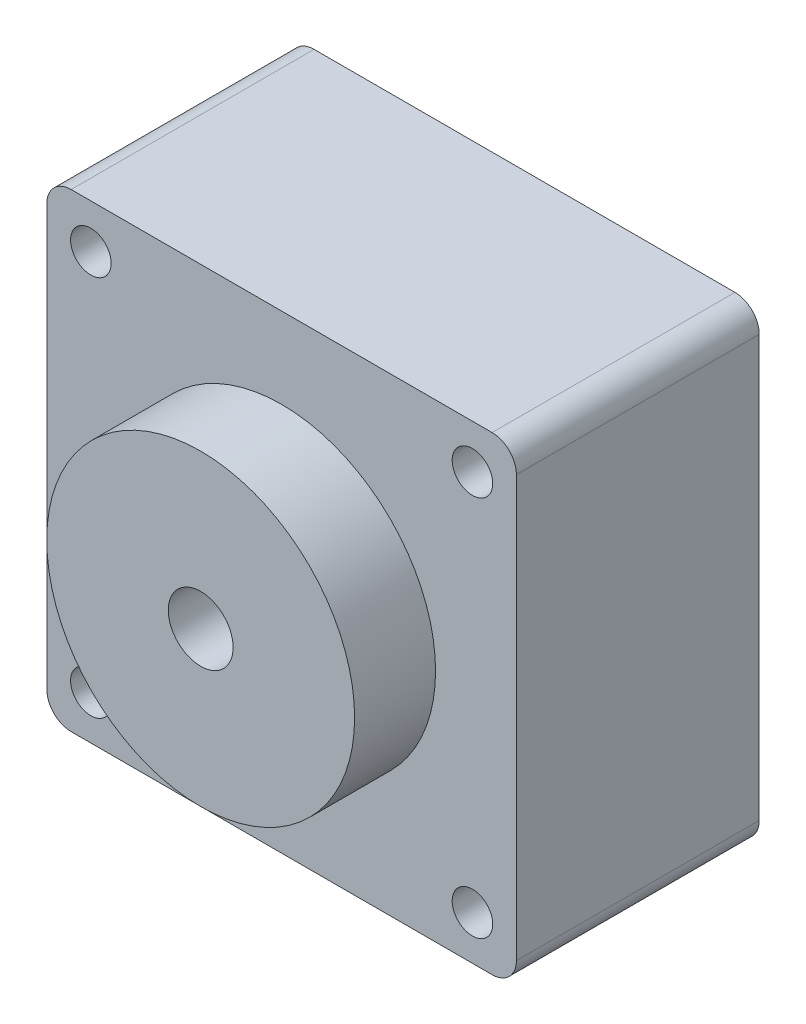
ISO-10303-21;
HEADER;
FILE_DESCRIPTION(('STEP AP214'),'2;1');
FILE_NAME('part.step','',(''),(''),'','','');
FILE_SCHEMA(('AUTOMOTIVE_DESIGN { 1 0 10303 214 1 1 1 1 }'));
ENDSEC;
DATA;
#1=APPLICATION_CONTEXT('core data for automotive mechanical design processes');
#2=APPLICATION_PROTOCOL_DEFINITION('international standard','automotive_design',2000,#1);
#3=PRODUCT_CONTEXT('',#1,'mechanical');
#4=PRODUCT('Part','Part','',(#3));
#5=PRODUCT_RELATED_PRODUCT_CATEGORY('part','',(#4));
#6=PRODUCT_DEFINITION_FORMATION('','',#4);
#7=PRODUCT_DEFINITION_CONTEXT('part definition',#1,'design');
#8=PRODUCT_DEFINITION('design','',#6,#7);
#9=PRODUCT_DEFINITION_SHAPE('','',#8);
#10=(LENGTH_UNIT() NAMED_UNIT(*) SI_UNIT(.MILLI.,.METRE.));
#11=(NAMED_UNIT(*) PLANE_ANGLE_UNIT() SI_UNIT($,.RADIAN.));
#12=(NAMED_UNIT(*) SI_UNIT($,.STERADIAN.) SOLID_ANGLE_UNIT());
#13=UNCERTAINTY_MEASURE_WITH_UNIT(LENGTH_MEASURE(1.E-05),#10,'distance_accuracy_value','');
#14=(GEOMETRIC_REPRESENTATION_CONTEXT(3) GLOBAL_UNCERTAINTY_ASSIGNED_CONTEXT((#13)) GLOBAL_UNIT_ASSIGNED_CONTEXT((#10,
#11,#12)) REPRESENTATION_CONTEXT('',''));
#15=CARTESIAN_POINT('',(0.,0.,0.));
#16=DIRECTION('',(0.,0.,1.));
#17=DIRECTION('',(1.,0.,0.));
#18=AXIS2_PLACEMENT_3D('',#15,#16,#17);
#19=CARTESIAN_POINT('',(3.,3.,30.));
#20=DIRECTION('',(0.,0.,-1.));
#21=DIRECTION('',(-1.,0.,0.));
#22=AXIS2_PLACEMENT_3D('',#19,#20,#21);
#23=CYLINDRICAL_SURFACE('',#22,3.);
#24=DIRECTION('',(0.,0.,-1.));
#25=VECTOR('',#24,1.);
#26=CARTESIAN_POINT('',(3.,0.,30.));
#27=LINE('',#26,#25);
#28=CARTESIAN_POINT('',(3.,0.,30.));
#29=VERTEX_POINT('',#28);
#30=CARTESIAN_POINT('',(3.,0.,0.));
#31=VERTEX_POINT('',#30);
#32=EDGE_CURVE('E168',#29,#31,#27,.T.);
#33=ORIENTED_EDGE('',*,*,#32,.F.);
#34=CARTESIAN_POINT('',(3.,3.,30.));
#35=DIRECTION('',(0.,0.,-1.));
#36=DIRECTION('',(-1.,0.,0.));
#37=AXIS2_PLACEMENT_3D('',#34,#35,#36);
#38=CIRCLE('',#37,3.);
#39=CARTESIAN_POINT('',(0.,3.,30.));
#40=VERTEX_POINT('',#39);
#41=EDGE_CURVE('E47',#40,#29,#38,.F.);
#42=ORIENTED_EDGE('',*,*,#41,.F.);
#43=DIRECTION('',(0.,0.,-1.));
#44=VECTOR('',#43,1.);
#45=CARTESIAN_POINT('',(0.,3.,30.));
#46=LINE('',#45,#44);
#47=CARTESIAN_POINT('',(0.,3.,0.));
#48=VERTEX_POINT('',#47);
#49=EDGE_CURVE('E172',#48,#40,#46,.F.);
#50=ORIENTED_EDGE('',*,*,#49,.F.);
#51=CARTESIAN_POINT('',(3.,3.,0.));
#52=DIRECTION('',(0.,0.,-1.));
#53=DIRECTION('',(-1.,0.,0.));
#54=AXIS2_PLACEMENT_3D('',#51,#52,#53);
#55=CIRCLE('',#54,3.);
#56=EDGE_CURVE('E11',#31,#48,#55,.T.);
#57=ORIENTED_EDGE('',*,*,#56,.F.);
#58=EDGE_LOOP('',(#33,#42,#50,#57));
#59=FACE_BOUND('',#58,.T.);
#60=ADVANCED_FACE('F39',(#59),#23,.T.);
#61=CARTESIAN_POINT('',(2.99999999999999,55.,30.));
#62=DIRECTION('',(0.,0.,1.));
#63=DIRECTION('',(1.,0.,0.));
#64=AXIS2_PLACEMENT_3D('',#61,#62,#63);
#65=CYLINDRICAL_SURFACE('',#64,3.);
#66=DIRECTION('',(0.,0.,1.));
#67=VECTOR('',#66,1.);
#68=CARTESIAN_POINT('',(2.99999999999999,58.,30.));
#69=LINE('',#68,#67);
#70=CARTESIAN_POINT('',(2.99999999999999,58.,0.));
#71=VERTEX_POINT('',#70);
#72=CARTESIAN_POINT('',(2.99999999999999,58.,30.));
#73=VERTEX_POINT('',#72);
#74=EDGE_CURVE('E154',#71,#73,#69,.T.);
#75=ORIENTED_EDGE('',*,*,#74,.F.);
#76=CARTESIAN_POINT('',(2.99999999999999,55.,0.));
#77=DIRECTION('',(0.,0.,-1.));
#78=DIRECTION('',(-1.,0.,0.));
#79=AXIS2_PLACEMENT_3D('',#76,#77,#78);
#80=CIRCLE('',#79,3.);
#81=CARTESIAN_POINT('',(0.,55.,0.));
#82=VERTEX_POINT('',#81);
#83=EDGE_CURVE('E162',#82,#71,#80,.T.);
#84=ORIENTED_EDGE('',*,*,#83,.F.);
#85=DIRECTION('',(0.,0.,1.));
#86=VECTOR('',#85,1.);
#87=CARTESIAN_POINT('',(0.,55.,30.));
#88=LINE('',#87,#86);
#89=CARTESIAN_POINT('',(0.,55.,30.));
#90=VERTEX_POINT('',#89);
#91=EDGE_CURVE('E158',#90,#82,#88,.F.);
#92=ORIENTED_EDGE('',*,*,#91,.F.);
#93=CARTESIAN_POINT('',(2.99999999999999,55.,30.));
#94=DIRECTION('',(0.,0.,-1.));
#95=DIRECTION('',(-1.,0.,0.));
#96=AXIS2_PLACEMENT_3D('',#93,#94,#95);
#97=CIRCLE('',#96,3.);
#98=EDGE_CURVE('E165',#73,#90,#97,.F.);
#99=ORIENTED_EDGE('',*,*,#98,.F.);
#100=EDGE_LOOP('',(#75,#84,#92,#99));
#101=FACE_BOUND('',#100,.T.);
#102=ADVANCED_FACE('F210',(#101),#65,.T.);
#103=CARTESIAN_POINT('',(55.,3.,30.));
#104=DIRECTION('',(0.,0.,1.));
#105=DIRECTION('',(1.,0.,0.));
#106=AXIS2_PLACEMENT_3D('',#103,#104,#105);
#107=CYLINDRICAL_SURFACE('',#106,3.);
#108=DIRECTION('',(0.,0.,1.));
#109=VECTOR('',#108,1.);
#110=CARTESIAN_POINT('',(55.,0.,30.));
#111=LINE('',#110,#109);
#112=CARTESIAN_POINT('',(55.,0.,0.));
#113=VERTEX_POINT('',#112);
#114=CARTESIAN_POINT('',(55.,0.,30.));
#115=VERTEX_POINT('',#114);
#116=EDGE_CURVE('E142',#113,#115,#111,.T.);
#117=ORIENTED_EDGE('',*,*,#116,.F.);
#118=CARTESIAN_POINT('',(55.,3.,0.));
#119=DIRECTION('',(0.,0.,-1.));
#120=DIRECTION('',(-1.,0.,0.));
#121=AXIS2_PLACEMENT_3D('',#118,#119,#120);
#122=CIRCLE('',#121,3.);
#123=CARTESIAN_POINT('',(58.,3.,0.));
#124=VERTEX_POINT('',#123);
#125=EDGE_CURVE('E148',#124,#113,#122,.T.);
#126=ORIENTED_EDGE('',*,*,#125,.F.);
#127=DIRECTION('',(0.,0.,1.));
#128=VECTOR('',#127,1.);
#129=CARTESIAN_POINT('',(58.,3.,30.));
#130=LINE('',#129,#128);
#131=CARTESIAN_POINT('',(58.,3.,30.));
#132=VERTEX_POINT('',#131);
#133=EDGE_CURVE('E110',#132,#124,#130,.F.);
#134=ORIENTED_EDGE('',*,*,#133,.F.);
#135=CARTESIAN_POINT('',(55.,3.,30.));
#136=DIRECTION('',(0.,0.,-1.));
#137=DIRECTION('',(-1.,0.,0.));
#138=AXIS2_PLACEMENT_3D('',#135,#136,#137);
#139=CIRCLE('',#138,3.);
#140=EDGE_CURVE('E151',#115,#132,#139,.F.);
#141=ORIENTED_EDGE('',*,*,#140,.F.);
#142=EDGE_LOOP('',(#117,#126,#134,#141));
#143=FACE_BOUND('',#142,.T.);
#144=ADVANCED_FACE('F204',(#143),#107,.T.);
#145=CARTESIAN_POINT('',(55.,55.,30.));
#146=DIRECTION('',(0.,0.,1.));
#147=DIRECTION('',(1.,0.,0.));
#148=AXIS2_PLACEMENT_3D('',#145,#146,#147);
#149=CYLINDRICAL_SURFACE('',#148,3.);
#150=DIRECTION('',(0.,0.,1.));
#151=VECTOR('',#150,1.);
#152=CARTESIAN_POINT('',(58.,55.,30.));
#153=LINE('',#152,#151);
#154=CARTESIAN_POINT('',(58.,55.,0.));
#155=VERTEX_POINT('',#154);
#156=CARTESIAN_POINT('',(58.,55.,30.));
#157=VERTEX_POINT('',#156);
#158=EDGE_CURVE('E108',#155,#157,#153,.T.);
#159=ORIENTED_EDGE('',*,*,#158,.F.);
#160=CARTESIAN_POINT('',(55.,55.,0.));
#161=DIRECTION('',(0.,0.,-1.));
#162=DIRECTION('',(-1.,0.,0.));
#163=AXIS2_PLACEMENT_3D('',#160,#161,#162);
#164=CIRCLE('',#163,3.);
#165=CARTESIAN_POINT('',(55.,58.,0.));
#166=VERTEX_POINT('',#165);
#167=EDGE_CURVE('E117',#166,#155,#164,.T.);
#168=ORIENTED_EDGE('',*,*,#167,.F.);
#169=DIRECTION('',(0.,0.,1.));
#170=VECTOR('',#169,1.);
#171=CARTESIAN_POINT('',(55.,58.,30.));
#172=LINE('',#171,#170);
#173=CARTESIAN_POINT('',(55.,58.,30.));
#174=VERTEX_POINT('',#173);
#175=EDGE_CURVE('E125',#174,#166,#172,.F.);
#176=ORIENTED_EDGE('',*,*,#175,.F.);
#177=CARTESIAN_POINT('',(55.,55.,30.));
#178=DIRECTION('',(0.,0.,-1.));
#179=DIRECTION('',(-1.,0.,0.));
#180=AXIS2_PLACEMENT_3D('',#177,#178,#179);
#181=CIRCLE('',#180,3.);
#182=EDGE_CURVE('E124',#157,#174,#181,.F.);
#183=ORIENTED_EDGE('',*,*,#182,.F.);
#184=EDGE_LOOP('',(#159,#168,#176,#183));
#185=FACE_BOUND('',#184,.T.);
#186=ADVANCED_FACE('F128',(#185),#149,.T.);
#187=CARTESIAN_POINT('',(0.,0.,30.));
#188=DIRECTION('',(1.,0.,0.));
#189=DIRECTION('',(0.,1.,0.));
#190=AXIS2_PLACEMENT_3D('',#187,#188,#189);
#191=PLANE('',#190);
#192=DIRECTION('',(0.,-1.,0.));
#193=VECTOR('',#192,1.);
#194=CARTESIAN_POINT('',(0.,0.,0.));
#195=LINE('',#194,#193);
#196=EDGE_CURVE('E197',#82,#48,#195,.T.);
#197=ORIENTED_EDGE('',*,*,#196,.T.);
#198=ORIENTED_EDGE('',*,*,#49,.T.);
#199=DIRECTION('',(0.,-1.,0.));
#200=VECTOR('',#199,1.);
#201=CARTESIAN_POINT('',(0.,0.,30.));
#202=LINE('',#201,#200);
#203=EDGE_CURVE('E182',#90,#40,#202,.T.);
#204=ORIENTED_EDGE('',*,*,#203,.F.);
#205=ORIENTED_EDGE('',*,*,#91,.T.);
#206=EDGE_LOOP('',(#197,#198,#204,#205));
#207=FACE_BOUND('',#206,.T.);
#208=ADVANCED_FACE('F213',(#207),#191,.F.);
#209=CARTESIAN_POINT('',(0.,0.,30.));
#210=DIRECTION('',(0.,1.,0.));
#211=DIRECTION('',(0.,0.,1.));
#212=AXIS2_PLACEMENT_3D('',#209,#210,#211);
#213=PLANE('',#212);
#214=DIRECTION('',(1.,0.,0.));
#215=VECTOR('',#214,1.);
#216=CARTESIAN_POINT('',(0.,0.,30.));
#217=LINE('',#216,#215);
#218=EDGE_CURVE('E179',#29,#115,#217,.T.);
#219=ORIENTED_EDGE('',*,*,#218,.F.);
#220=ORIENTED_EDGE('',*,*,#32,.T.);
#221=DIRECTION('',(1.,0.,0.));
#222=VECTOR('',#221,1.);
#223=CARTESIAN_POINT('',(0.,0.,0.));
#224=LINE('',#223,#222);
#225=EDGE_CURVE('E114',#31,#113,#224,.T.);
#226=ORIENTED_EDGE('',*,*,#225,.T.);
#227=ORIENTED_EDGE('',*,*,#116,.T.);
#228=EDGE_LOOP('',(#219,#220,#226,#227));
#229=FACE_BOUND('',#228,.T.);
#230=ADVANCED_FACE('F184',(#229),#213,.F.);
#231=CARTESIAN_POINT('',(58.,0.,30.));
#232=DIRECTION('',(-1.,0.,0.));
#233=DIRECTION('',(0.,-1.,0.));
#234=AXIS2_PLACEMENT_3D('',#231,#232,#233);
#235=PLANE('',#234);
#236=DIRECTION('',(0.,1.,0.));
#237=VECTOR('',#236,1.);
#238=CARTESIAN_POINT('',(58.,0.,30.));
#239=LINE('',#238,#237);
#240=EDGE_CURVE('E187',#132,#157,#239,.T.);
#241=ORIENTED_EDGE('',*,*,#240,.F.);
#242=ORIENTED_EDGE('',*,*,#133,.T.);
#243=DIRECTION('',(0.,1.,0.));
#244=VECTOR('',#243,1.);
#245=CARTESIAN_POINT('',(58.,0.,0.));
#246=LINE('',#245,#244);
#247=EDGE_CURVE('E103',#124,#155,#246,.T.);
#248=ORIENTED_EDGE('',*,*,#247,.T.);
#249=ORIENTED_EDGE('',*,*,#158,.T.);
#250=EDGE_LOOP('',(#241,#242,#248,#249));
#251=FACE_BOUND('',#250,.T.);
#252=ADVANCED_FACE('F106',(#251),#235,.F.);
#253=CARTESIAN_POINT('',(0.,58.,30.));
#254=DIRECTION('',(0.,-1.,0.));
#255=DIRECTION('',(0.,0.,-1.));
#256=AXIS2_PLACEMENT_3D('',#253,#254,#255);
#257=PLANE('',#256);
#258=DIRECTION('',(-1.,0.,0.));
#259=VECTOR('',#258,1.);
#260=CARTESIAN_POINT('',(0.,58.,0.));
#261=LINE('',#260,#259);
#262=EDGE_CURVE('E113',#166,#71,#261,.T.);
#263=ORIENTED_EDGE('',*,*,#262,.T.);
#264=ORIENTED_EDGE('',*,*,#74,.T.);
#265=DIRECTION('',(-1.,0.,0.));
#266=VECTOR('',#265,1.);
#267=CARTESIAN_POINT('',(0.,58.,30.));
#268=LINE('',#267,#266);
#269=EDGE_CURVE('E136',#174,#73,#268,.T.);
#270=ORIENTED_EDGE('',*,*,#269,.F.);
#271=ORIENTED_EDGE('',*,*,#175,.T.);
#272=EDGE_LOOP('',(#263,#264,#270,#271));
#273=FACE_BOUND('',#272,.T.);
#274=ADVANCED_FACE('F207',(#273),#257,.F.);
#275=CARTESIAN_POINT('',(0.,0.,30.));
#276=DIRECTION('',(0.,0.,-1.));
#277=DIRECTION('',(-1.,0.,0.));
#278=AXIS2_PLACEMENT_3D('',#275,#276,#277);
#279=PLANE('',#278);
#280=CARTESIAN_POINT('',(52.57,5.4300000000001,30.));
#281=DIRECTION('',(0.,0.,1.));
#282=DIRECTION('',(1.,0.,0.));
#283=AXIS2_PLACEMENT_3D('',#280,#281,#282);
#284=CIRCLE('',#283,2.505);
#285=CARTESIAN_POINT('',(55.075,5.4300000000001,30.));
#286=VERTEX_POINT('',#285);
#287=EDGE_CURVE('E377',#286,#286,#284,.T.);
#288=ORIENTED_EDGE('',*,*,#287,.F.);
#289=EDGE_LOOP('',(#288));
#290=FACE_BOUND('',#289,.T.);
#291=CARTESIAN_POINT('',(5.42999999999999,5.43,30.));
#292=DIRECTION('',(0.,0.,1.));
#293=DIRECTION('',(1.,0.,0.));
#294=AXIS2_PLACEMENT_3D('',#291,#292,#293);
#295=CIRCLE('',#294,2.505);
#296=CARTESIAN_POINT('',(7.93499999999999,5.43,30.));
#297=VERTEX_POINT('',#296);
#298=EDGE_CURVE('E381',#297,#297,#295,.T.);
#299=ORIENTED_EDGE('',*,*,#298,.F.);
#300=EDGE_LOOP('',(#299));
#301=FACE_BOUND('',#300,.T.);
#302=CARTESIAN_POINT('',(5.42999999999999,52.57,30.));
#303=DIRECTION('',(0.,0.,1.));
#304=DIRECTION('',(1.,0.,0.));
#305=AXIS2_PLACEMENT_3D('',#302,#303,#304);
#306=CIRCLE('',#305,2.505);
#307=CARTESIAN_POINT('',(7.93499999999999,52.57,30.));
#308=VERTEX_POINT('',#307);
#309=EDGE_CURVE('E385',#308,#308,#306,.T.);
#310=ORIENTED_EDGE('',*,*,#309,.F.);
#311=EDGE_LOOP('',(#310));
#312=FACE_BOUND('',#311,.T.);
#313=CARTESIAN_POINT('',(52.57,52.5700000000001,30.));
#314=DIRECTION('',(0.,0.,1.));
#315=DIRECTION('',(1.,0.,0.));
#316=AXIS2_PLACEMENT_3D('',#313,#314,#315);
#317=CIRCLE('',#316,2.505);
#318=CARTESIAN_POINT('',(55.075,52.5700000000001,30.));
#319=VERTEX_POINT('',#318);
#320=EDGE_CURVE('E389',#319,#319,#317,.T.);
#321=ORIENTED_EDGE('',*,*,#320,.F.);
#322=EDGE_LOOP('',(#321));
#323=FACE_BOUND('',#322,.T.);
#324=CARTESIAN_POINT('',(29.,29.,30.));
#325=DIRECTION('',(0.,0.,1.));
#326=DIRECTION('',(1.,0.,0.));
#327=AXIS2_PLACEMENT_3D('',#324,#325,#326);
#328=CIRCLE('',#327,19.015);
#329=CARTESIAN_POINT('',(48.015,29.,30.));
#330=VERTEX_POINT('',#329);
#331=EDGE_CURVE('E130',#330,#330,#328,.T.);
#332=ORIENTED_EDGE('',*,*,#331,.F.);
#333=EDGE_LOOP('',(#332));
#334=FACE_BOUND('',#333,.T.);
#335=ORIENTED_EDGE('',*,*,#203,.T.);
#336=ORIENTED_EDGE('',*,*,#41,.T.);
#337=ORIENTED_EDGE('',*,*,#218,.T.);
#338=ORIENTED_EDGE('',*,*,#140,.T.);
#339=ORIENTED_EDGE('',*,*,#240,.T.);
#340=ORIENTED_EDGE('',*,*,#182,.T.);
#341=ORIENTED_EDGE('',*,*,#269,.T.);
#342=ORIENTED_EDGE('',*,*,#98,.T.);
#343=EDGE_LOOP('',(#335,#336,#337,#338,#339,#340,#341,#342));
#344=FACE_BOUND('',#343,.T.);
#345=ADVANCED_FACE('F177',(#290,#301,#312,#323,#334,#344),#279,.F.);
#346=CARTESIAN_POINT('',(0.,0.,0.));
#347=DIRECTION('',(0.,0.,-1.));
#348=DIRECTION('',(-1.,0.,0.));
#349=AXIS2_PLACEMENT_3D('',#346,#347,#348);
#350=PLANE('',#349);
#351=CARTESIAN_POINT('',(52.57,5.4300000000001,0.));
#352=DIRECTION('',(0.,0.,1.));
#353=DIRECTION('',(1.,0.,0.));
#354=AXIS2_PLACEMENT_3D('',#351,#352,#353);
#355=CIRCLE('',#354,2.505);
#356=CARTESIAN_POINT('',(55.075,5.4300000000001,0.));
#357=VERTEX_POINT('',#356);
#358=EDGE_CURVE('E422',#357,#357,#355,.T.);
#359=ORIENTED_EDGE('',*,*,#358,.T.);
#360=EDGE_LOOP('',(#359));
#361=FACE_BOUND('',#360,.T.);
#362=CARTESIAN_POINT('',(5.42999999999999,5.43,0.));
#363=DIRECTION('',(0.,0.,1.));
#364=DIRECTION('',(1.,0.,0.));
#365=AXIS2_PLACEMENT_3D('',#362,#363,#364);
#366=CIRCLE('',#365,2.505);
#367=CARTESIAN_POINT('',(7.93499999999999,5.43,0.));
#368=VERTEX_POINT('',#367);
#369=EDGE_CURVE('E428',#368,#368,#366,.T.);
#370=ORIENTED_EDGE('',*,*,#369,.T.);
#371=EDGE_LOOP('',(#370));
#372=FACE_BOUND('',#371,.T.);
#373=CARTESIAN_POINT('',(5.42999999999999,52.57,0.));
#374=DIRECTION('',(0.,0.,1.));
#375=DIRECTION('',(1.,0.,0.));
#376=AXIS2_PLACEMENT_3D('',#373,#374,#375);
#377=CIRCLE('',#376,2.505);
#378=CARTESIAN_POINT('',(7.93499999999999,52.57,0.));
#379=VERTEX_POINT('',#378);
#380=EDGE_CURVE('E395',#379,#379,#377,.T.);
#381=ORIENTED_EDGE('',*,*,#380,.T.);
#382=EDGE_LOOP('',(#381));
#383=FACE_BOUND('',#382,.T.);
#384=CARTESIAN_POINT('',(52.57,52.5700000000001,0.));
#385=DIRECTION('',(0.,0.,1.));
#386=DIRECTION('',(1.,0.,0.));
#387=AXIS2_PLACEMENT_3D('',#384,#385,#386);
#388=CIRCLE('',#387,2.505);
#389=CARTESIAN_POINT('',(55.075,52.5700000000001,0.));
#390=VERTEX_POINT('',#389);
#391=EDGE_CURVE('E394',#390,#390,#388,.T.);
#392=ORIENTED_EDGE('',*,*,#391,.T.);
#393=EDGE_LOOP('',(#392));
#394=FACE_BOUND('',#393,.T.);
#395=ORIENTED_EDGE('',*,*,#225,.F.);
#396=ORIENTED_EDGE('',*,*,#56,.T.);
#397=ORIENTED_EDGE('',*,*,#196,.F.);
#398=ORIENTED_EDGE('',*,*,#83,.T.);
#399=ORIENTED_EDGE('',*,*,#262,.F.);
#400=ORIENTED_EDGE('',*,*,#167,.T.);
#401=ORIENTED_EDGE('',*,*,#247,.F.);
#402=ORIENTED_EDGE('',*,*,#125,.T.);
#403=EDGE_LOOP('',(#395,#396,#397,#398,#399,#400,#401,#402));
#404=FACE_BOUND('',#403,.T.);
#405=ADVANCED_FACE('F118',(#361,#372,#383,#394,#404),#350,.T.);
#406=CARTESIAN_POINT('',(29.,29.,40.));
#407=DIRECTION('',(0.,0.,-1.));
#408=DIRECTION('',(-1.,0.,0.));
#409=AXIS2_PLACEMENT_3D('',#406,#407,#408);
#410=CYLINDRICAL_SURFACE('',#409,19.015);
#411=CARTESIAN_POINT('',(29.,29.,40.));
#412=DIRECTION('',(0.,0.,1.));
#413=DIRECTION('',(1.,0.,0.));
#414=AXIS2_PLACEMENT_3D('',#411,#412,#413);
#415=CIRCLE('',#414,19.015);
#416=CARTESIAN_POINT('',(48.015,29.,40.));
#417=VERTEX_POINT('',#416);
#418=EDGE_CURVE('E201',#417,#417,#415,.T.);
#419=ORIENTED_EDGE('',*,*,#418,.F.);
#420=EDGE_LOOP('',(#419));
#421=FACE_BOUND('',#420,.T.);
#422=ORIENTED_EDGE('',*,*,#331,.T.);
#423=EDGE_LOOP('',(#422));
#424=FACE_BOUND('',#423,.T.);
#425=ADVANCED_FACE('F307',(#421,#424),#410,.T.);
#426=CARTESIAN_POINT('',(29.,29.,40.));
#427=DIRECTION('',(0.,0.,1.));
#428=DIRECTION('',(1.,0.,0.));
#429=AXIS2_PLACEMENT_3D('',#426,#427,#428);
#430=PLANE('',#429);
#431=CARTESIAN_POINT('',(29.,29.,40.));
#432=DIRECTION('',(0.,0.,1.));
#433=DIRECTION('',(1.,0.,0.));
#434=AXIS2_PLACEMENT_3D('',#431,#432,#433);
#435=CIRCLE('',#434,4.005);
#436=CARTESIAN_POINT('',(33.005,29.,40.));
#437=VERTEX_POINT('',#436);
#438=EDGE_CURVE('E400',#437,#437,#435,.T.);
#439=ORIENTED_EDGE('',*,*,#438,.F.);
#440=EDGE_LOOP('',(#439));
#441=FACE_BOUND('',#440,.T.);
#442=ORIENTED_EDGE('',*,*,#418,.T.);
#443=EDGE_LOOP('',(#442));
#444=FACE_BOUND('',#443,.T.);
#445=ADVANCED_FACE('F297',(#441,#444),#430,.T.);
#446=CARTESIAN_POINT('',(29.,29.,15.));
#447=DIRECTION('',(0.,0.,1.));
#448=DIRECTION('',(1.,0.,0.));
#449=AXIS2_PLACEMENT_3D('',#446,#447,#448);
#450=CYLINDRICAL_SURFACE('',#449,4.005);
#451=CARTESIAN_POINT('',(29.,29.,15.));
#452=DIRECTION('',(0.,0.,1.));
#453=DIRECTION('',(1.,0.,0.));
#454=AXIS2_PLACEMENT_3D('',#451,#452,#453);
#455=CIRCLE('',#454,4.005);
#456=CARTESIAN_POINT('',(33.005,29.,15.));
#457=VERTEX_POINT('',#456);
#458=EDGE_CURVE('E406',#457,#457,#455,.T.);
#459=ORIENTED_EDGE('',*,*,#458,.F.);
#460=EDGE_LOOP('',(#459));
#461=FACE_BOUND('',#460,.T.);
#462=ORIENTED_EDGE('',*,*,#438,.T.);
#463=EDGE_LOOP('',(#462));
#464=FACE_BOUND('',#463,.T.);
#465=ADVANCED_FACE('F287',(#461,#464),#450,.F.);
#466=CARTESIAN_POINT('',(29.,29.,15.));
#467=DIRECTION('',(0.,0.,1.));
#468=DIRECTION('',(1.,0.,0.));
#469=AXIS2_PLACEMENT_3D('',#466,#467,#468);
#470=PLANE('',#469);
#471=ORIENTED_EDGE('',*,*,#458,.T.);
#472=EDGE_LOOP('',(#471));
#473=FACE_BOUND('',#472,.T.);
#474=ADVANCED_FACE('F277',(#473),#470,.T.);
#475=CARTESIAN_POINT('',(52.57,52.5700000000001,0.));
#476=DIRECTION('',(0.,0.,1.));
#477=DIRECTION('',(1.,0.,0.));
#478=AXIS2_PLACEMENT_3D('',#475,#476,#477);
#479=CYLINDRICAL_SURFACE('',#478,2.505);
#480=ORIENTED_EDGE('',*,*,#391,.F.);
#481=EDGE_LOOP('',(#480));
#482=FACE_BOUND('',#481,.T.);
#483=ORIENTED_EDGE('',*,*,#320,.T.);
#484=EDGE_LOOP('',(#483));
#485=FACE_BOUND('',#484,.T.);
#486=ADVANCED_FACE('F267',(#482,#485),#479,.F.);
#487=CARTESIAN_POINT('',(5.42999999999999,52.57,0.));
#488=DIRECTION('',(0.,0.,1.));
#489=DIRECTION('',(1.,0.,0.));
#490=AXIS2_PLACEMENT_3D('',#487,#488,#489);
#491=CYLINDRICAL_SURFACE('',#490,2.505);
#492=ORIENTED_EDGE('',*,*,#380,.F.);
#493=EDGE_LOOP('',(#492));
#494=FACE_BOUND('',#493,.T.);
#495=ORIENTED_EDGE('',*,*,#309,.T.);
#496=EDGE_LOOP('',(#495));
#497=FACE_BOUND('',#496,.T.);
#498=ADVANCED_FACE('F257',(#494,#497),#491,.F.);
#499=CARTESIAN_POINT('',(5.42999999999999,5.43,0.));
#500=DIRECTION('',(0.,0.,1.));
#501=DIRECTION('',(1.,0.,0.));
#502=AXIS2_PLACEMENT_3D('',#499,#500,#501);
#503=CYLINDRICAL_SURFACE('',#502,2.505);
#504=ORIENTED_EDGE('',*,*,#369,.F.);
#505=EDGE_LOOP('',(#504));
#506=FACE_BOUND('',#505,.T.);
#507=ORIENTED_EDGE('',*,*,#298,.T.);
#508=EDGE_LOOP('',(#507));
#509=FACE_BOUND('',#508,.T.);
#510=ADVANCED_FACE('F247',(#506,#509),#503,.F.);
#511=CARTESIAN_POINT('',(52.57,5.4300000000001,0.));
#512=DIRECTION('',(0.,0.,1.));
#513=DIRECTION('',(1.,0.,0.));
#514=AXIS2_PLACEMENT_3D('',#511,#512,#513);
#515=CYLINDRICAL_SURFACE('',#514,2.505);
#516=ORIENTED_EDGE('',*,*,#358,.F.);
#517=EDGE_LOOP('',(#516));
#518=FACE_BOUND('',#517,.T.);
#519=ORIENTED_EDGE('',*,*,#287,.T.);
#520=EDGE_LOOP('',(#519));
#521=FACE_BOUND('',#520,.T.);
#522=ADVANCED_FACE('F243',(#518,#521),#515,.F.);
#523=CLOSED_SHELL('',(#60,#102,#144,#186,#208,#230,#252,#274,#345,#405,#425,#445,#465,#474,#486,
#498,#510,#522));
#524=MANIFOLD_SOLID_BREP('B2',#523);
#525=ADVANCED_BREP_SHAPE_REPRESENTATION('',(#18,#524),#14);
#526=SHAPE_DEFINITION_REPRESENTATION(#9,#525);
ENDSEC;
END-ISO-10303-21;
